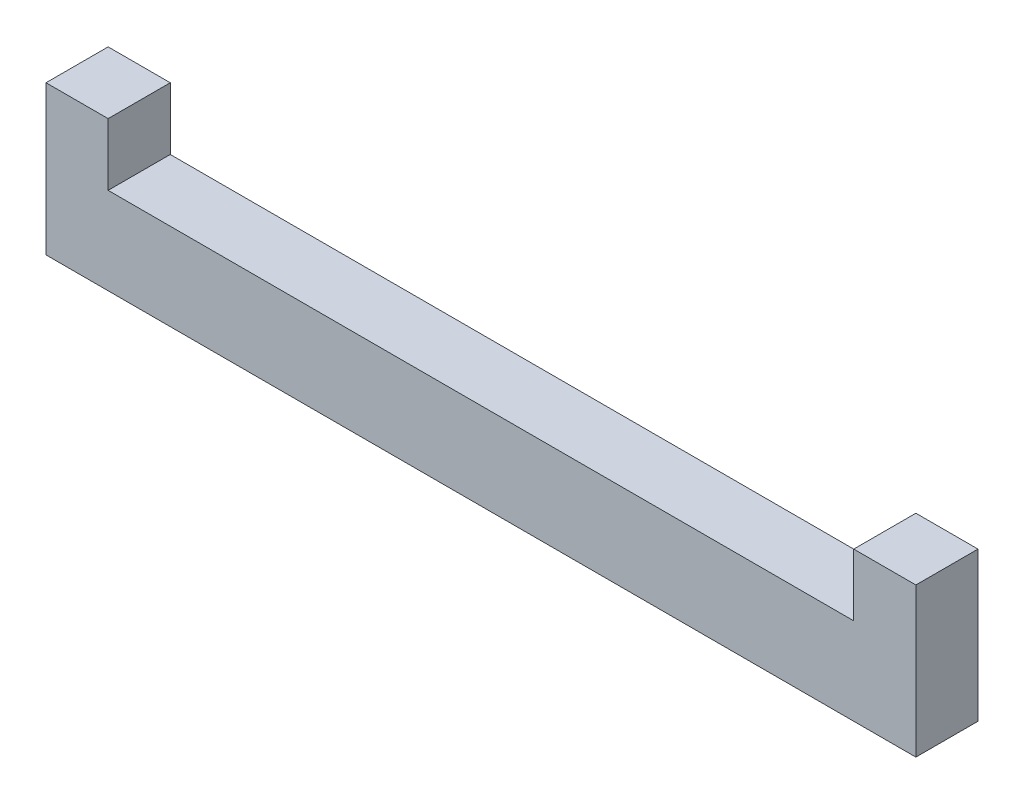
ISO-10303-21;
HEADER;
FILE_DESCRIPTION(('STEP AP214'),'2;1');
FILE_NAME('part.step','',(''),(''),'','','');
FILE_SCHEMA(('AUTOMOTIVE_DESIGN { 1 0 10303 214 1 1 1 1 }'));
ENDSEC;
DATA;
#1=APPLICATION_CONTEXT('core data for automotive mechanical design processes');
#2=APPLICATION_PROTOCOL_DEFINITION('international standard','automotive_design',2000,#1);
#3=PRODUCT_CONTEXT('',#1,'mechanical');
#4=PRODUCT('Part','Part','',(#3));
#5=PRODUCT_RELATED_PRODUCT_CATEGORY('part','',(#4));
#6=PRODUCT_DEFINITION_FORMATION('','',#4);
#7=PRODUCT_DEFINITION_CONTEXT('part definition',#1,'design');
#8=PRODUCT_DEFINITION('design','',#6,#7);
#9=PRODUCT_DEFINITION_SHAPE('','',#8);
#10=(LENGTH_UNIT() NAMED_UNIT(*) SI_UNIT(.MILLI.,.METRE.));
#11=(NAMED_UNIT(*) PLANE_ANGLE_UNIT() SI_UNIT($,.RADIAN.));
#12=(NAMED_UNIT(*) SI_UNIT($,.STERADIAN.) SOLID_ANGLE_UNIT());
#13=UNCERTAINTY_MEASURE_WITH_UNIT(LENGTH_MEASURE(1.E-05),#10,'distance_accuracy_value','');
#14=(GEOMETRIC_REPRESENTATION_CONTEXT(3) GLOBAL_UNCERTAINTY_ASSIGNED_CONTEXT((#13)) GLOBAL_UNIT_ASSIGNED_CONTEXT((#10,
#11,#12)) REPRESENTATION_CONTEXT('',''));
#15=CARTESIAN_POINT('',(0.,0.,0.));
#16=DIRECTION('',(0.,0.,1.));
#17=DIRECTION('',(1.,0.,0.));
#18=AXIS2_PLACEMENT_3D('',#15,#16,#17);
#19=CARTESIAN_POINT('',(-133.983627477066,222.421111622309,-5.));
#20=DIRECTION('',(-1.,0.,0.));
#21=DIRECTION('',(0.,-1.,0.));
#22=AXIS2_PLACEMENT_3D('',#19,#20,#21);
#23=PLANE('',#22);
#24=DIRECTION('',(0.,-1.,0.));
#25=VECTOR('',#24,1.);
#26=CARTESIAN_POINT('',(-133.983627477066,222.421111622309,0.));
#27=LINE('',#26,#25);
#28=CARTESIAN_POINT('',(-133.983627477066,222.421111622309,0.));
#29=VERTEX_POINT('',#28);
#30=CARTESIAN_POINT('',(-133.983627477066,210.421111622309,0.));
#31=VERTEX_POINT('',#30);
#32=EDGE_CURVE('E130',#29,#31,#27,.T.);
#33=ORIENTED_EDGE('',*,*,#32,.F.);
#34=DIRECTION('',(0.,0.,1.));
#35=VECTOR('',#34,1.);
#36=CARTESIAN_POINT('',(-133.983627477066,222.421111622309,-5.));
#37=LINE('',#36,#35);
#38=CARTESIAN_POINT('',(-133.983627477066,222.421111622309,-5.));
#39=VERTEX_POINT('',#38);
#40=EDGE_CURVE('E11',#39,#29,#37,.T.);
#41=ORIENTED_EDGE('',*,*,#40,.F.);
#42=DIRECTION('',(0.,-1.,0.));
#43=VECTOR('',#42,1.);
#44=CARTESIAN_POINT('',(-133.983627477066,222.421111622309,-5.));
#45=LINE('',#44,#43);
#46=CARTESIAN_POINT('',(-133.983627477066,210.421111622309,-5.));
#47=VERTEX_POINT('',#46);
#48=EDGE_CURVE('E150',#39,#47,#45,.T.);
#49=ORIENTED_EDGE('',*,*,#48,.T.);
#50=DIRECTION('',(0.,0.,1.));
#51=VECTOR('',#50,1.);
#52=CARTESIAN_POINT('',(-133.983627477066,210.421111622309,-5.));
#53=LINE('',#52,#51);
#54=EDGE_CURVE('E36',#47,#31,#53,.T.);
#55=ORIENTED_EDGE('',*,*,#54,.T.);
#56=EDGE_LOOP('',(#33,#41,#49,#55));
#57=FACE_BOUND('',#56,.T.);
#58=ADVANCED_FACE('F33',(#57),#23,.T.);
#59=CARTESIAN_POINT('',(-133.983627477066,222.421111622309,-5.));
#60=DIRECTION('',(0.,1.,0.));
#61=DIRECTION('',(0.,0.,1.));
#62=AXIS2_PLACEMENT_3D('',#59,#60,#61);
#63=PLANE('',#62);
#64=DIRECTION('',(-1.,0.,0.));
#65=VECTOR('',#64,1.);
#66=CARTESIAN_POINT('',(-133.983627477066,222.421111622309,0.));
#67=LINE('',#66,#65);
#68=CARTESIAN_POINT('',(-128.983627477066,222.421111622309,0.));
#69=VERTEX_POINT('',#68);
#70=EDGE_CURVE('E148',#69,#29,#67,.T.);
#71=ORIENTED_EDGE('',*,*,#70,.F.);
#72=DIRECTION('',(0.,0.,1.));
#73=VECTOR('',#72,1.);
#74=CARTESIAN_POINT('',(-128.983627477066,222.421111622309,-5.));
#75=LINE('',#74,#73);
#76=CARTESIAN_POINT('',(-128.983627477066,222.421111622309,-5.));
#77=VERTEX_POINT('',#76);
#78=EDGE_CURVE('E42',#77,#69,#75,.T.);
#79=ORIENTED_EDGE('',*,*,#78,.F.);
#80=DIRECTION('',(-1.,0.,0.));
#81=VECTOR('',#80,1.);
#82=CARTESIAN_POINT('',(-133.983627477066,222.421111622309,-5.));
#83=LINE('',#82,#81);
#84=EDGE_CURVE('E120',#77,#39,#83,.T.);
#85=ORIENTED_EDGE('',*,*,#84,.T.);
#86=ORIENTED_EDGE('',*,*,#40,.T.);
#87=EDGE_LOOP('',(#71,#79,#85,#86));
#88=FACE_BOUND('',#87,.T.);
#89=ADVANCED_FACE('F162',(#88),#63,.T.);
#90=CARTESIAN_POINT('',(-128.983627477066,222.421111622309,-5.));
#91=DIRECTION('',(1.,0.,0.));
#92=DIRECTION('',(0.,0.,-1.));
#93=AXIS2_PLACEMENT_3D('',#90,#91,#92);
#94=PLANE('',#93);
#95=DIRECTION('',(0.,1.,0.));
#96=VECTOR('',#95,1.);
#97=CARTESIAN_POINT('',(-128.983627477066,222.421111622309,0.));
#98=LINE('',#97,#96);
#99=CARTESIAN_POINT('',(-128.983627477066,217.421111622309,0.));
#100=VERTEX_POINT('',#99);
#101=EDGE_CURVE('E107',#100,#69,#98,.T.);
#102=ORIENTED_EDGE('',*,*,#101,.F.);
#103=DIRECTION('',(0.,0.,1.));
#104=VECTOR('',#103,1.);
#105=CARTESIAN_POINT('',(-128.983627477066,217.421111622309,-5.));
#106=LINE('',#105,#104);
#107=CARTESIAN_POINT('',(-128.983627477066,217.421111622309,-5.));
#108=VERTEX_POINT('',#107);
#109=EDGE_CURVE('E102',#108,#100,#106,.T.);
#110=ORIENTED_EDGE('',*,*,#109,.F.);
#111=DIRECTION('',(0.,1.,0.));
#112=VECTOR('',#111,1.);
#113=CARTESIAN_POINT('',(-128.983627477066,222.421111622309,-5.));
#114=LINE('',#113,#112);
#115=EDGE_CURVE('E105',#108,#77,#114,.T.);
#116=ORIENTED_EDGE('',*,*,#115,.T.);
#117=ORIENTED_EDGE('',*,*,#78,.T.);
#118=EDGE_LOOP('',(#102,#110,#116,#117));
#119=FACE_BOUND('',#118,.T.);
#120=ADVANCED_FACE('F104',(#119),#94,.T.);
#121=CARTESIAN_POINT('',(-128.983627477066,217.421111622309,-5.));
#122=DIRECTION('',(0.,1.,0.));
#123=DIRECTION('',(0.,0.,1.));
#124=AXIS2_PLACEMENT_3D('',#121,#122,#123);
#125=PLANE('',#124);
#126=DIRECTION('',(-1.,0.,0.));
#127=VECTOR('',#126,1.);
#128=CARTESIAN_POINT('',(-128.983627477066,217.421111622309,0.));
#129=LINE('',#128,#127);
#130=CARTESIAN_POINT('',(-68.9836274770661,217.421111622309,0.));
#131=VERTEX_POINT('',#130);
#132=EDGE_CURVE('E145',#131,#100,#129,.T.);
#133=ORIENTED_EDGE('',*,*,#132,.F.);
#134=DIRECTION('',(0.,0.,1.));
#135=VECTOR('',#134,1.);
#136=CARTESIAN_POINT('',(-68.9836274770661,217.421111622309,-5.));
#137=LINE('',#136,#135);
#138=CARTESIAN_POINT('',(-68.9836274770661,217.421111622309,-5.));
#139=VERTEX_POINT('',#138);
#140=EDGE_CURVE('E112',#139,#131,#137,.T.);
#141=ORIENTED_EDGE('',*,*,#140,.F.);
#142=DIRECTION('',(-1.,0.,0.));
#143=VECTOR('',#142,1.);
#144=CARTESIAN_POINT('',(-128.983627477066,217.421111622309,-5.));
#145=LINE('',#144,#143);
#146=EDGE_CURVE('E118',#139,#108,#145,.T.);
#147=ORIENTED_EDGE('',*,*,#146,.T.);
#148=ORIENTED_EDGE('',*,*,#109,.T.);
#149=EDGE_LOOP('',(#133,#141,#147,#148));
#150=FACE_BOUND('',#149,.T.);
#151=ADVANCED_FACE('F122',(#150),#125,.T.);
#152=CARTESIAN_POINT('',(-68.9836274770661,222.421111622309,-5.));
#153=DIRECTION('',(-1.,0.,0.));
#154=DIRECTION('',(0.,0.,1.));
#155=AXIS2_PLACEMENT_3D('',#152,#153,#154);
#156=PLANE('',#155);
#157=DIRECTION('',(0.,-1.,0.));
#158=VECTOR('',#157,1.);
#159=CARTESIAN_POINT('',(-68.9836274770661,222.421111622309,0.));
#160=LINE('',#159,#158);
#161=CARTESIAN_POINT('',(-68.9836274770661,222.421111622309,0.));
#162=VERTEX_POINT('',#161);
#163=EDGE_CURVE('E142',#162,#131,#160,.T.);
#164=ORIENTED_EDGE('',*,*,#163,.F.);
#165=DIRECTION('',(0.,0.,1.));
#166=VECTOR('',#165,1.);
#167=CARTESIAN_POINT('',(-68.9836274770661,222.421111622309,-5.));
#168=LINE('',#167,#166);
#169=CARTESIAN_POINT('',(-68.9836274770661,222.421111622309,-5.));
#170=VERTEX_POINT('',#169);
#171=EDGE_CURVE('E154',#170,#162,#168,.T.);
#172=ORIENTED_EDGE('',*,*,#171,.F.);
#173=DIRECTION('',(0.,-1.,0.));
#174=VECTOR('',#173,1.);
#175=CARTESIAN_POINT('',(-68.9836274770661,222.421111622309,-5.));
#176=LINE('',#175,#174);
#177=EDGE_CURVE('E123',#170,#139,#176,.T.);
#178=ORIENTED_EDGE('',*,*,#177,.T.);
#179=ORIENTED_EDGE('',*,*,#140,.T.);
#180=EDGE_LOOP('',(#164,#172,#178,#179));
#181=FACE_BOUND('',#180,.T.);
#182=ADVANCED_FACE('F175',(#181),#156,.T.);
#183=CARTESIAN_POINT('',(-63.9836274770661,222.421111622309,-5.));
#184=DIRECTION('',(0.,1.,0.));
#185=DIRECTION('',(-1.,0.,0.));
#186=AXIS2_PLACEMENT_3D('',#183,#184,#185);
#187=PLANE('',#186);
#188=DIRECTION('',(-1.,0.,0.));
#189=VECTOR('',#188,1.);
#190=CARTESIAN_POINT('',(-63.9836274770661,222.421111622309,0.));
#191=LINE('',#190,#189);
#192=CARTESIAN_POINT('',(-63.9836274770661,222.421111622309,0.));
#193=VERTEX_POINT('',#192);
#194=EDGE_CURVE('E139',#193,#162,#191,.T.);
#195=ORIENTED_EDGE('',*,*,#194,.F.);
#196=DIRECTION('',(0.,0.,1.));
#197=VECTOR('',#196,1.);
#198=CARTESIAN_POINT('',(-63.9836274770661,222.421111622309,-5.));
#199=LINE('',#198,#197);
#200=CARTESIAN_POINT('',(-63.9836274770661,222.421111622309,-5.));
#201=VERTEX_POINT('',#200);
#202=EDGE_CURVE('E156',#201,#193,#199,.T.);
#203=ORIENTED_EDGE('',*,*,#202,.F.);
#204=DIRECTION('',(-1.,0.,0.));
#205=VECTOR('',#204,1.);
#206=CARTESIAN_POINT('',(-63.9836274770661,222.421111622309,-5.));
#207=LINE('',#206,#205);
#208=EDGE_CURVE('E125',#201,#170,#207,.T.);
#209=ORIENTED_EDGE('',*,*,#208,.T.);
#210=ORIENTED_EDGE('',*,*,#171,.T.);
#211=EDGE_LOOP('',(#195,#203,#209,#210));
#212=FACE_BOUND('',#211,.T.);
#213=ADVANCED_FACE('F178',(#212),#187,.T.);
#214=CARTESIAN_POINT('',(-63.9836274770661,222.421111622309,-5.));
#215=DIRECTION('',(1.,0.,0.));
#216=DIRECTION('',(0.,0.,-1.));
#217=AXIS2_PLACEMENT_3D('',#214,#215,#216);
#218=PLANE('',#217);
#219=DIRECTION('',(0.,1.,0.));
#220=VECTOR('',#219,1.);
#221=CARTESIAN_POINT('',(-63.9836274770661,222.421111622309,0.));
#222=LINE('',#221,#220);
#223=CARTESIAN_POINT('',(-63.9836274770661,210.421111622309,0.));
#224=VERTEX_POINT('',#223);
#225=EDGE_CURVE('E136',#224,#193,#222,.T.);
#226=ORIENTED_EDGE('',*,*,#225,.F.);
#227=DIRECTION('',(0.,0.,1.));
#228=VECTOR('',#227,1.);
#229=CARTESIAN_POINT('',(-63.9836274770661,210.421111622309,-5.));
#230=LINE('',#229,#228);
#231=CARTESIAN_POINT('',(-63.9836274770661,210.421111622309,-5.));
#232=VERTEX_POINT('',#231);
#233=EDGE_CURVE('E157',#232,#224,#230,.T.);
#234=ORIENTED_EDGE('',*,*,#233,.F.);
#235=DIRECTION('',(0.,1.,0.));
#236=VECTOR('',#235,1.);
#237=CARTESIAN_POINT('',(-63.9836274770661,222.421111622309,-5.));
#238=LINE('',#237,#236);
#239=EDGE_CURVE('E253',#232,#201,#238,.T.);
#240=ORIENTED_EDGE('',*,*,#239,.T.);
#241=ORIENTED_EDGE('',*,*,#202,.T.);
#242=EDGE_LOOP('',(#226,#234,#240,#241));
#243=FACE_BOUND('',#242,.T.);
#244=ADVANCED_FACE('F182',(#243),#218,.T.);
#245=CARTESIAN_POINT('',(-133.983627477066,210.421111622309,-5.));
#246=DIRECTION('',(0.,-1.,0.));
#247=DIRECTION('',(0.,0.,-1.));
#248=AXIS2_PLACEMENT_3D('',#245,#246,#247);
#249=PLANE('',#248);
#250=DIRECTION('',(1.,0.,0.));
#251=VECTOR('',#250,1.);
#252=CARTESIAN_POINT('',(-133.983627477066,210.421111622309,0.));
#253=LINE('',#252,#251);
#254=EDGE_CURVE('E133',#31,#224,#253,.T.);
#255=ORIENTED_EDGE('',*,*,#254,.F.);
#256=ORIENTED_EDGE('',*,*,#54,.F.);
#257=DIRECTION('',(1.,0.,0.));
#258=VECTOR('',#257,1.);
#259=CARTESIAN_POINT('',(-133.983627477066,210.421111622309,-5.));
#260=LINE('',#259,#258);
#261=EDGE_CURVE('E254',#47,#232,#260,.T.);
#262=ORIENTED_EDGE('',*,*,#261,.T.);
#263=ORIENTED_EDGE('',*,*,#233,.T.);
#264=EDGE_LOOP('',(#255,#256,#262,#263));
#265=FACE_BOUND('',#264,.T.);
#266=ADVANCED_FACE('F159',(#265),#249,.T.);
#267=CARTESIAN_POINT('',(0.,0.,-5.));
#268=DIRECTION('',(0.,0.,1.));
#269=DIRECTION('',(1.,0.,0.));
#270=AXIS2_PLACEMENT_3D('',#267,#268,#269);
#271=PLANE('',#270);
#272=ORIENTED_EDGE('',*,*,#48,.F.);
#273=ORIENTED_EDGE('',*,*,#84,.F.);
#274=ORIENTED_EDGE('',*,*,#115,.F.);
#275=ORIENTED_EDGE('',*,*,#146,.F.);
#276=ORIENTED_EDGE('',*,*,#177,.F.);
#277=ORIENTED_EDGE('',*,*,#208,.F.);
#278=ORIENTED_EDGE('',*,*,#239,.F.);
#279=ORIENTED_EDGE('',*,*,#261,.F.);
#280=EDGE_LOOP('',(#272,#273,#274,#275,#276,#277,#278,#279));
#281=FACE_BOUND('',#280,.T.);
#282=ADVANCED_FACE('F116',(#281),#271,.F.);
#283=CARTESIAN_POINT('',(0.,0.,0.));
#284=DIRECTION('',(0.,0.,1.));
#285=DIRECTION('',(1.,0.,0.));
#286=AXIS2_PLACEMENT_3D('',#283,#284,#285);
#287=PLANE('',#286);
#288=ORIENTED_EDGE('',*,*,#32,.T.);
#289=ORIENTED_EDGE('',*,*,#254,.T.);
#290=ORIENTED_EDGE('',*,*,#225,.T.);
#291=ORIENTED_EDGE('',*,*,#194,.T.);
#292=ORIENTED_EDGE('',*,*,#163,.T.);
#293=ORIENTED_EDGE('',*,*,#132,.T.);
#294=ORIENTED_EDGE('',*,*,#101,.T.);
#295=ORIENTED_EDGE('',*,*,#70,.T.);
#296=EDGE_LOOP('',(#288,#289,#290,#291,#292,#293,#294,#295));
#297=FACE_BOUND('',#296,.T.);
#298=ADVANCED_FACE('F161',(#297),#287,.T.);
#299=CLOSED_SHELL('',(#58,#89,#120,#151,#182,#213,#244,#266,#282,#298));
#300=MANIFOLD_SOLID_BREP('B2',#299);
#301=ADVANCED_BREP_SHAPE_REPRESENTATION('',(#18,#300),#14);
#302=SHAPE_DEFINITION_REPRESENTATION(#9,#301);
ENDSEC;
END-ISO-10303-21;
